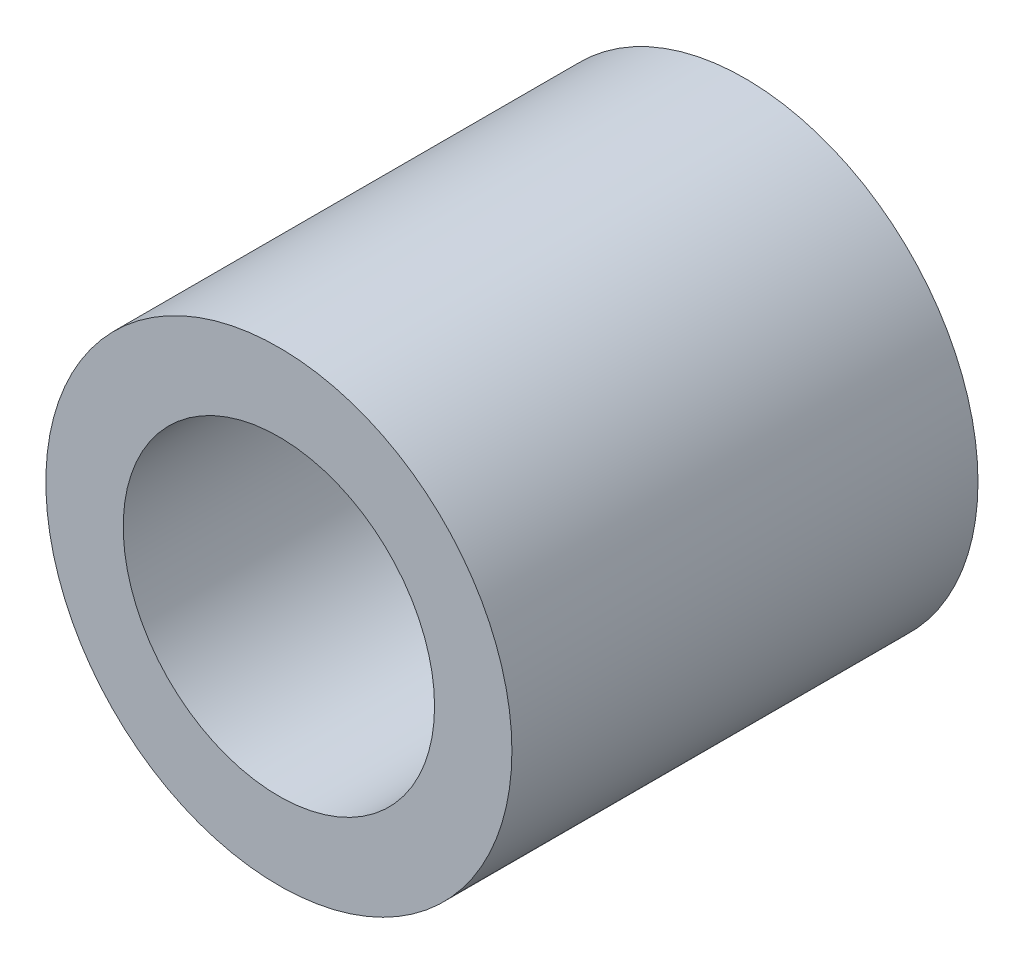
ISO-10303-21;
HEADER;
FILE_DESCRIPTION(('STEP AP214'),'2;1');
FILE_NAME('part.step','',(''),(''),'','','');
FILE_SCHEMA(('AUTOMOTIVE_DESIGN { 1 0 10303 214 1 1 1 1 }'));
ENDSEC;
DATA;
#1=APPLICATION_CONTEXT('core data for automotive mechanical design processes');
#2=APPLICATION_PROTOCOL_DEFINITION('international standard','automotive_design',2000,#1);
#3=PRODUCT_CONTEXT('',#1,'mechanical');
#4=PRODUCT('Part','Part','',(#3));
#5=PRODUCT_RELATED_PRODUCT_CATEGORY('part','',(#4));
#6=PRODUCT_DEFINITION_FORMATION('','',#4);
#7=PRODUCT_DEFINITION_CONTEXT('part definition',#1,'design');
#8=PRODUCT_DEFINITION('design','',#6,#7);
#9=PRODUCT_DEFINITION_SHAPE('','',#8);
#10=(LENGTH_UNIT() NAMED_UNIT(*) SI_UNIT(.MILLI.,.METRE.));
#11=(NAMED_UNIT(*) PLANE_ANGLE_UNIT() SI_UNIT($,.RADIAN.));
#12=(NAMED_UNIT(*) SI_UNIT($,.STERADIAN.) SOLID_ANGLE_UNIT());
#13=UNCERTAINTY_MEASURE_WITH_UNIT(LENGTH_MEASURE(1.E-05),#10,'distance_accuracy_value','');
#14=(GEOMETRIC_REPRESENTATION_CONTEXT(3) GLOBAL_UNCERTAINTY_ASSIGNED_CONTEXT((#13)) GLOBAL_UNIT_ASSIGNED_CONTEXT((#10,
#11,#12)) REPRESENTATION_CONTEXT('',''));
#15=CARTESIAN_POINT('',(0.,0.,0.));
#16=DIRECTION('',(0.,0.,1.));
#17=DIRECTION('',(1.,0.,0.));
#18=AXIS2_PLACEMENT_3D('',#15,#16,#17);
#19=CARTESIAN_POINT('',(0.,0.,2.5));
#20=DIRECTION('',(0.,0.,1.));
#21=DIRECTION('',(1.,0.,0.));
#22=AXIS2_PLACEMENT_3D('',#19,#20,#21);
#23=PLANE('',#22);
#24=CARTESIAN_POINT('',(0.,0.,2.5));
#25=DIRECTION('',(0.,0.,1.));
#26=DIRECTION('',(1.,0.,0.));
#27=AXIS2_PLACEMENT_3D('',#24,#25,#26);
#28=CIRCLE('',#27,1.25);
#29=CARTESIAN_POINT('',(1.25,0.,2.5));
#30=VERTEX_POINT('',#29);
#31=EDGE_CURVE('E10',#30,#30,#28,.T.);
#32=ORIENTED_EDGE('',*,*,#31,.T.);
#33=EDGE_LOOP('',(#32));
#34=FACE_BOUND('',#33,.T.);
#35=CARTESIAN_POINT('',(0.,0.,2.5));
#36=DIRECTION('',(0.,0.,1.));
#37=DIRECTION('',(1.,0.,0.));
#38=AXIS2_PLACEMENT_3D('',#35,#36,#37);
#39=CIRCLE('',#38,0.835);
#40=CARTESIAN_POINT('',(0.835,0.,2.5));
#41=VERTEX_POINT('',#40);
#42=EDGE_CURVE('E43',#41,#41,#39,.T.);
#43=ORIENTED_EDGE('',*,*,#42,.F.);
#44=EDGE_LOOP('',(#43));
#45=FACE_BOUND('',#44,.T.);
#46=ADVANCED_FACE('F32',(#34,#45),#23,.T.);
#47=CARTESIAN_POINT('',(0.,0.,0.));
#48=DIRECTION('',(0.,0.,1.));
#49=DIRECTION('',(1.,0.,0.));
#50=AXIS2_PLACEMENT_3D('',#47,#48,#49);
#51=PLANE('',#50);
#52=CARTESIAN_POINT('',(0.,0.,0.));
#53=DIRECTION('',(0.,0.,1.));
#54=DIRECTION('',(1.,0.,0.));
#55=AXIS2_PLACEMENT_3D('',#52,#53,#54);
#56=CIRCLE('',#55,1.25);
#57=CARTESIAN_POINT('',(1.25,0.,0.));
#58=VERTEX_POINT('',#57);
#59=EDGE_CURVE('E36',#58,#58,#56,.T.);
#60=ORIENTED_EDGE('',*,*,#59,.F.);
#61=EDGE_LOOP('',(#60));
#62=FACE_BOUND('',#61,.T.);
#63=CARTESIAN_POINT('',(0.,0.,0.));
#64=DIRECTION('',(0.,0.,1.));
#65=DIRECTION('',(1.,0.,0.));
#66=AXIS2_PLACEMENT_3D('',#63,#64,#65);
#67=CIRCLE('',#66,0.835);
#68=CARTESIAN_POINT('',(0.835,0.,0.));
#69=VERTEX_POINT('',#68);
#70=EDGE_CURVE('E45',#69,#69,#67,.T.);
#71=ORIENTED_EDGE('',*,*,#70,.T.);
#72=EDGE_LOOP('',(#71));
#73=FACE_BOUND('',#72,.T.);
#74=ADVANCED_FACE('F55',(#62,#73),#51,.F.);
#75=CARTESIAN_POINT('',(0.,0.,2.5));
#76=DIRECTION('',(0.,0.,-1.));
#77=DIRECTION('',(-1.,0.,0.));
#78=AXIS2_PLACEMENT_3D('',#75,#76,#77);
#79=CYLINDRICAL_SURFACE('',#78,1.25);
#80=ORIENTED_EDGE('',*,*,#31,.F.);
#81=EDGE_LOOP('',(#80));
#82=FACE_BOUND('',#81,.T.);
#83=ORIENTED_EDGE('',*,*,#59,.T.);
#84=EDGE_LOOP('',(#83));
#85=FACE_BOUND('',#84,.T.);
#86=ADVANCED_FACE('F34',(#82,#85),#79,.T.);
#87=CARTESIAN_POINT('',(0.,0.,2.5));
#88=DIRECTION('',(0.,0.,-1.));
#89=DIRECTION('',(-1.,0.,0.));
#90=AXIS2_PLACEMENT_3D('',#87,#88,#89);
#91=CYLINDRICAL_SURFACE('',#90,0.835);
#92=ORIENTED_EDGE('',*,*,#42,.T.);
#93=EDGE_LOOP('',(#92));
#94=FACE_BOUND('',#93,.T.);
#95=ORIENTED_EDGE('',*,*,#70,.F.);
#96=EDGE_LOOP('',(#95));
#97=FACE_BOUND('',#96,.T.);
#98=ADVANCED_FACE('F51',(#94,#97),#91,.F.);
#99=CLOSED_SHELL('',(#46,#74,#86,#98));
#100=MANIFOLD_SOLID_BREP('B2',#99);
#101=ADVANCED_BREP_SHAPE_REPRESENTATION('',(#18,#100),#14);
#102=SHAPE_DEFINITION_REPRESENTATION(#9,#101);
ENDSEC;
END-ISO-10303-21;
